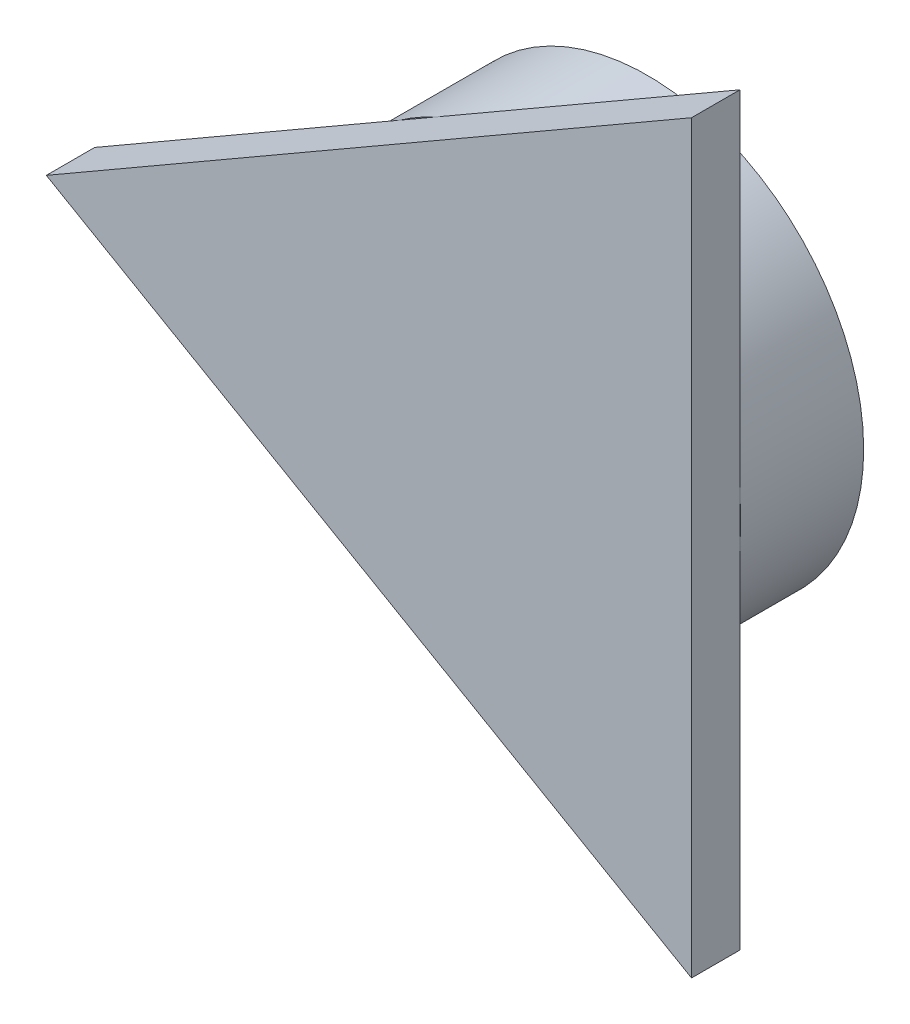
ISO-10303-21;
HEADER;
FILE_DESCRIPTION(('STEP AP214'),'2;1');
FILE_NAME('part.step','',(''),(''),'','','');
FILE_SCHEMA(('AUTOMOTIVE_DESIGN { 1 0 10303 214 1 1 1 1 }'));
ENDSEC;
DATA;
#1=APPLICATION_CONTEXT('core data for automotive mechanical design processes');
#2=APPLICATION_PROTOCOL_DEFINITION('international standard','automotive_design',2000,#1);
#3=PRODUCT_CONTEXT('',#1,'mechanical');
#4=PRODUCT('Part','Part','',(#3));
#5=PRODUCT_RELATED_PRODUCT_CATEGORY('part','',(#4));
#6=PRODUCT_DEFINITION_FORMATION('','',#4);
#7=PRODUCT_DEFINITION_CONTEXT('part definition',#1,'design');
#8=PRODUCT_DEFINITION('design','',#6,#7);
#9=PRODUCT_DEFINITION_SHAPE('','',#8);
#10=(LENGTH_UNIT() NAMED_UNIT(*) SI_UNIT(.MILLI.,.METRE.));
#11=(NAMED_UNIT(*) PLANE_ANGLE_UNIT() SI_UNIT($,.RADIAN.));
#12=(NAMED_UNIT(*) SI_UNIT($,.STERADIAN.) SOLID_ANGLE_UNIT());
#13=UNCERTAINTY_MEASURE_WITH_UNIT(LENGTH_MEASURE(1.E-05),#10,'distance_accuracy_value','');
#14=(GEOMETRIC_REPRESENTATION_CONTEXT(3) GLOBAL_UNCERTAINTY_ASSIGNED_CONTEXT((#13)) GLOBAL_UNIT_ASSIGNED_CONTEXT((#10,
#11,#12)) REPRESENTATION_CONTEXT('',''));
#15=CARTESIAN_POINT('',(0.,0.,0.));
#16=DIRECTION('',(0.,0.,1.));
#17=DIRECTION('',(1.,0.,0.));
#18=AXIS2_PLACEMENT_3D('',#15,#16,#17);
#19=CARTESIAN_POINT('',(0.,0.,19.32));
#20=DIRECTION('',(0.,0.,-1.));
#21=DIRECTION('',(-1.,0.,0.));
#22=AXIS2_PLACEMENT_3D('',#19,#20,#21);
#23=PLANE('',#22);
#24=DIRECTION('',(0.,-1.,0.));
#25=VECTOR('',#24,1.);
#26=CARTESIAN_POINT('',(46.3560854460703,55.3258458873863,19.32));
#27=LINE('',#26,#25);
#28=CARTESIAN_POINT('',(46.3560854460703,55.3258458873863,19.32));
#29=VERTEX_POINT('',#28);
#30=CARTESIAN_POINT('',(46.3560854460703,48.0355474470044,19.32));
#31=VERTEX_POINT('',#30);
#32=EDGE_CURVE('E116',#29,#31,#27,.T.);
#33=ORIENTED_EDGE('',*,*,#32,.T.);
#34=CARTESIAN_POINT('',(41.91,47.625,19.32));
#35=DIRECTION('',(0.,0.,1.));
#36=DIRECTION('',(1.,0.,0.));
#37=AXIS2_PLACEMENT_3D('',#34,#35,#36);
#38=CIRCLE('',#37,4.465);
#39=CARTESIAN_POINT('',(40.0425017955296,51.6806966671954,19.32));
#40=VERTEX_POINT('',#39);
#41=EDGE_CURVE('E108',#31,#40,#38,.T.);
#42=ORIENTED_EDGE('',*,*,#41,.T.);
#43=DIRECTION('',(0.866025403784439,0.5,0.));
#44=VECTOR('',#43,1.);
#45=CARTESIAN_POINT('',(33.0178291078594,47.625,19.32));
#46=LINE('',#45,#44);
#47=EDGE_CURVE('E64',#40,#29,#46,.T.);
#48=ORIENTED_EDGE('',*,*,#47,.T.);
#49=EDGE_LOOP('',(#33,#42,#48));
#50=FACE_BOUND('',#49,.T.);
#51=ADVANCED_FACE('F37',(#50),#23,.T.);
#52=CARTESIAN_POINT('',(33.0178291078594,47.625,19.32));
#53=VERTEX_POINT('',#52);
#54=CARTESIAN_POINT('',(39.3314127584001,51.2701492201909,19.32));
#55=VERTEX_POINT('',#54);
#56=EDGE_CURVE('E132',#53,#55,#46,.T.);
#57=ORIENTED_EDGE('',*,*,#56,.T.);
#58=CARTESIAN_POINT('',(39.3314127584002,43.979850779809,19.32));
#59=VERTEX_POINT('',#58);
#60=EDGE_CURVE('E11',#55,#59,#38,.T.);
#61=ORIENTED_EDGE('',*,*,#60,.T.);
#62=DIRECTION('',(-0.866025403784439,0.5,0.));
#63=VECTOR('',#62,1.);
#64=CARTESIAN_POINT('',(46.3560854460703,39.9241541126137,19.32));
#65=LINE('',#64,#63);
#66=EDGE_CURVE('E119',#59,#53,#65,.T.);
#67=ORIENTED_EDGE('',*,*,#66,.T.);
#68=EDGE_LOOP('',(#57,#61,#67));
#69=FACE_BOUND('',#68,.T.);
#70=ADVANCED_FACE('F157',(#69),#23,.T.);
#71=CARTESIAN_POINT('',(46.3560854460703,39.9241541126137,19.32));
#72=VERTEX_POINT('',#71);
#73=CARTESIAN_POINT('',(40.0425017955294,43.5693033328047,19.32));
#74=VERTEX_POINT('',#73);
#75=EDGE_CURVE('E122',#72,#74,#65,.T.);
#76=ORIENTED_EDGE('',*,*,#75,.T.);
#77=CARTESIAN_POINT('',(46.3560854460703,47.2144525529956,19.32));
#78=VERTEX_POINT('',#77);
#79=EDGE_CURVE('E46',#74,#78,#38,.T.);
#80=ORIENTED_EDGE('',*,*,#79,.T.);
#81=EDGE_CURVE('E89',#78,#72,#27,.T.);
#82=ORIENTED_EDGE('',*,*,#81,.T.);
#83=EDGE_LOOP('',(#76,#80,#82));
#84=FACE_BOUND('',#83,.T.);
#85=ADVANCED_FACE('F172',(#84),#23,.T.);
#86=CARTESIAN_POINT('',(46.3560854460703,55.3258458873863,19.32));
#87=DIRECTION('',(-1.,0.,0.));
#88=DIRECTION('',(0.,0.,1.));
#89=AXIS2_PLACEMENT_3D('',#86,#87,#88);
#90=PLANE('',#89);
#91=DIRECTION('',(0.,-1.,0.));
#92=VECTOR('',#91,1.);
#93=CARTESIAN_POINT('',(46.3560854460703,55.3258458873863,20.32));
#94=LINE('',#93,#92);
#95=CARTESIAN_POINT('',(46.3560854460703,55.3258458873863,20.32));
#96=VERTEX_POINT('',#95);
#97=CARTESIAN_POINT('',(46.3560854460703,39.9241541126137,20.32));
#98=VERTEX_POINT('',#97);
#99=EDGE_CURVE('E126',#96,#98,#94,.T.);
#100=ORIENTED_EDGE('',*,*,#99,.T.);
#101=DIRECTION('',(0.,0.,1.));
#102=VECTOR('',#101,1.);
#103=CARTESIAN_POINT('',(46.3560854460703,39.9241541126137,19.32));
#104=LINE('',#103,#102);
#105=EDGE_CURVE('E41',#72,#98,#104,.T.);
#106=ORIENTED_EDGE('',*,*,#105,.F.);
#107=ORIENTED_EDGE('',*,*,#81,.F.);
#108=EDGE_CURVE('E106',#31,#78,#27,.T.);
#109=ORIENTED_EDGE('',*,*,#108,.F.);
#110=ORIENTED_EDGE('',*,*,#32,.F.);
#111=DIRECTION('',(0.,0.,1.));
#112=VECTOR('',#111,1.);
#113=CARTESIAN_POINT('',(46.3560854460703,55.3258458873863,19.32));
#114=LINE('',#113,#112);
#115=EDGE_CURVE('E130',#29,#96,#114,.T.);
#116=ORIENTED_EDGE('',*,*,#115,.T.);
#117=EDGE_LOOP('',(#100,#106,#107,#109,#110,#116));
#118=FACE_BOUND('',#117,.T.);
#119=ADVANCED_FACE('F39',(#118),#90,.F.);
#120=CARTESIAN_POINT('',(46.3560854460703,39.9241541126137,19.32));
#121=DIRECTION('',(0.5,0.866025403784439,0.));
#122=DIRECTION('',(-0.866025403784439,0.5,0.));
#123=AXIS2_PLACEMENT_3D('',#120,#121,#122);
#124=PLANE('',#123);
#125=DIRECTION('',(-0.866025403784439,0.5,0.));
#126=VECTOR('',#125,1.);
#127=CARTESIAN_POINT('',(46.3560854460703,39.9241541126137,20.32));
#128=LINE('',#127,#126);
#129=CARTESIAN_POINT('',(33.0178291078594,47.625,20.32));
#130=VERTEX_POINT('',#129);
#131=EDGE_CURVE('E124',#98,#130,#128,.T.);
#132=ORIENTED_EDGE('',*,*,#131,.T.);
#133=DIRECTION('',(0.,0.,1.));
#134=VECTOR('',#133,1.);
#135=CARTESIAN_POINT('',(33.0178291078594,47.625,19.32));
#136=LINE('',#135,#134);
#137=EDGE_CURVE('E131',#53,#130,#136,.T.);
#138=ORIENTED_EDGE('',*,*,#137,.F.);
#139=ORIENTED_EDGE('',*,*,#66,.F.);
#140=EDGE_CURVE('E120',#74,#59,#65,.T.);
#141=ORIENTED_EDGE('',*,*,#140,.F.);
#142=ORIENTED_EDGE('',*,*,#75,.F.);
#143=ORIENTED_EDGE('',*,*,#105,.T.);
#144=EDGE_LOOP('',(#132,#138,#139,#141,#142,#143));
#145=FACE_BOUND('',#144,.T.);
#146=ADVANCED_FACE('F158',(#145),#124,.F.);
#147=CARTESIAN_POINT('',(33.0178291078594,47.625,19.32));
#148=DIRECTION('',(0.5,-0.866025403784439,0.));
#149=DIRECTION('',(0.866025403784439,0.5,0.));
#150=AXIS2_PLACEMENT_3D('',#147,#148,#149);
#151=PLANE('',#150);
#152=DIRECTION('',(0.866025403784439,0.5,0.));
#153=VECTOR('',#152,1.);
#154=CARTESIAN_POINT('',(33.0178291078594,47.625,20.32));
#155=LINE('',#154,#153);
#156=EDGE_CURVE('E82',#130,#96,#155,.T.);
#157=ORIENTED_EDGE('',*,*,#156,.T.);
#158=ORIENTED_EDGE('',*,*,#115,.F.);
#159=ORIENTED_EDGE('',*,*,#47,.F.);
#160=EDGE_CURVE('E149',#55,#40,#46,.T.);
#161=ORIENTED_EDGE('',*,*,#160,.F.);
#162=ORIENTED_EDGE('',*,*,#56,.F.);
#163=ORIENTED_EDGE('',*,*,#137,.T.);
#164=EDGE_LOOP('',(#157,#158,#159,#161,#162,#163));
#165=FACE_BOUND('',#164,.T.);
#166=ADVANCED_FACE('F160',(#165),#151,.F.);
#167=CARTESIAN_POINT('',(0.,0.,20.32));
#168=DIRECTION('',(0.,0.,-1.));
#169=DIRECTION('',(-1.,0.,0.));
#170=AXIS2_PLACEMENT_3D('',#167,#168,#169);
#171=PLANE('',#170);
#172=ORIENTED_EDGE('',*,*,#99,.F.);
#173=ORIENTED_EDGE('',*,*,#156,.F.);
#174=ORIENTED_EDGE('',*,*,#131,.F.);
#175=EDGE_LOOP('',(#172,#173,#174));
#176=FACE_BOUND('',#175,.T.);
#177=ADVANCED_FACE('F178',(#176),#171,.F.);
#178=CARTESIAN_POINT('',(0.,0.,19.32));
#179=DIRECTION('',(0.,0.,1.));
#180=DIRECTION('',(1.,0.,0.));
#181=AXIS2_PLACEMENT_3D('',#178,#179,#180);
#182=PLANE('',#181);
#183=EDGE_CURVE('E55',#78,#31,#38,.T.);
#184=ORIENTED_EDGE('',*,*,#183,.T.);
#185=ORIENTED_EDGE('',*,*,#108,.T.);
#186=EDGE_LOOP('',(#184,#185));
#187=FACE_BOUND('',#186,.T.);
#188=ADVANCED_FACE('F104',(#187),#182,.T.);
#189=EDGE_CURVE('E107',#59,#74,#38,.T.);
#190=ORIENTED_EDGE('',*,*,#189,.T.);
#191=ORIENTED_EDGE('',*,*,#140,.T.);
#192=EDGE_LOOP('',(#190,#191));
#193=FACE_BOUND('',#192,.T.);
#194=ADVANCED_FACE('F154',(#193),#182,.T.);
#195=CARTESIAN_POINT('',(41.91,47.625,26.6697222151364));
#196=DIRECTION('',(0.,0.,-1.));
#197=DIRECTION('',(-1.,0.,0.));
#198=AXIS2_PLACEMENT_3D('',#195,#196,#197);
#199=CYLINDRICAL_SURFACE('',#198,1.925);
#200=CARTESIAN_POINT('',(41.91,47.625,16.78));
#201=DIRECTION('',(0.,0.,-1.));
#202=DIRECTION('',(-1.,0.,0.));
#203=AXIS2_PLACEMENT_3D('',#200,#201,#202);
#204=CIRCLE('',#203,1.925);
#205=CARTESIAN_POINT('',(39.985,47.625,16.78));
#206=VERTEX_POINT('',#205);
#207=EDGE_CURVE('E140',#206,#206,#204,.T.);
#208=ORIENTED_EDGE('',*,*,#207,.T.);
#209=EDGE_LOOP('',(#208));
#210=FACE_BOUND('',#209,.T.);
#211=CARTESIAN_POINT('',(41.91,47.625,19.32));
#212=DIRECTION('',(0.,0.,1.));
#213=DIRECTION('',(1.,0.,0.));
#214=AXIS2_PLACEMENT_3D('',#211,#212,#213);
#215=CIRCLE('',#214,1.925);
#216=CARTESIAN_POINT('',(43.835,47.625,19.32));
#217=VERTEX_POINT('',#216);
#218=EDGE_CURVE('E112',#217,#217,#215,.F.);
#219=ORIENTED_EDGE('',*,*,#218,.F.);
#220=EDGE_LOOP('',(#219));
#221=FACE_BOUND('',#220,.T.);
#222=ADVANCED_FACE('F180',(#210,#221),#199,.F.);
#223=CARTESIAN_POINT('',(41.91,47.625,16.78));
#224=DIRECTION('',(0.,0.,-1.));
#225=DIRECTION('',(-1.,0.,0.));
#226=AXIS2_PLACEMENT_3D('',#223,#224,#225);
#227=PLANE('',#226);
#228=CARTESIAN_POINT('',(41.91,47.625,16.78));
#229=DIRECTION('',(0.,0.,-1.));
#230=DIRECTION('',(-1.,0.,0.));
#231=AXIS2_PLACEMENT_3D('',#228,#229,#230);
#232=CIRCLE('',#231,4.465);
#233=CARTESIAN_POINT('',(37.445,47.625,16.78));
#234=VERTEX_POINT('',#233);
#235=EDGE_CURVE('E142',#234,#234,#232,.T.);
#236=ORIENTED_EDGE('',*,*,#235,.T.);
#237=EDGE_LOOP('',(#236));
#238=FACE_BOUND('',#237,.T.);
#239=ORIENTED_EDGE('',*,*,#207,.F.);
#240=EDGE_LOOP('',(#239));
#241=FACE_BOUND('',#240,.T.);
#242=ADVANCED_FACE('F173',(#238,#241),#227,.T.);
#243=CARTESIAN_POINT('',(41.91,47.625,16.78));
#244=DIRECTION('',(0.,0.,1.));
#245=DIRECTION('',(1.,0.,0.));
#246=AXIS2_PLACEMENT_3D('',#243,#244,#245);
#247=CYLINDRICAL_SURFACE('',#246,4.465);
#248=ORIENTED_EDGE('',*,*,#235,.F.);
#249=EDGE_LOOP('',(#248));
#250=FACE_BOUND('',#249,.T.);
#251=ORIENTED_EDGE('',*,*,#41,.F.);
#252=ORIENTED_EDGE('',*,*,#183,.F.);
#253=ORIENTED_EDGE('',*,*,#79,.F.);
#254=ORIENTED_EDGE('',*,*,#189,.F.);
#255=ORIENTED_EDGE('',*,*,#60,.F.);
#256=EDGE_CURVE('E48',#40,#55,#38,.T.);
#257=ORIENTED_EDGE('',*,*,#256,.F.);
#258=EDGE_LOOP('',(#251,#252,#253,#254,#255,#257));
#259=FACE_BOUND('',#258,.T.);
#260=ADVANCED_FACE('F110',(#250,#259),#247,.T.);
#261=ORIENTED_EDGE('',*,*,#256,.T.);
#262=ORIENTED_EDGE('',*,*,#160,.T.);
#263=EDGE_LOOP('',(#261,#262));
#264=FACE_BOUND('',#263,.T.);
#265=ADVANCED_FACE('F162',(#264),#182,.T.);
#266=ORIENTED_EDGE('',*,*,#218,.T.);
#267=EDGE_LOOP('',(#266));
#268=FACE_BOUND('',#267,.T.);
#269=ADVANCED_FACE('F164',(#268),#23,.T.);
#270=CLOSED_SHELL('',(#51,#70,#85,#119,#146,#166,#177,#188,#194,#222,#242,#260,#265,#269));
#271=MANIFOLD_SOLID_BREP('B2',#270);
#272=ADVANCED_BREP_SHAPE_REPRESENTATION('',(#18,#271),#14);
#273=SHAPE_DEFINITION_REPRESENTATION(#9,#272);
ENDSEC;
END-ISO-10303-21;
